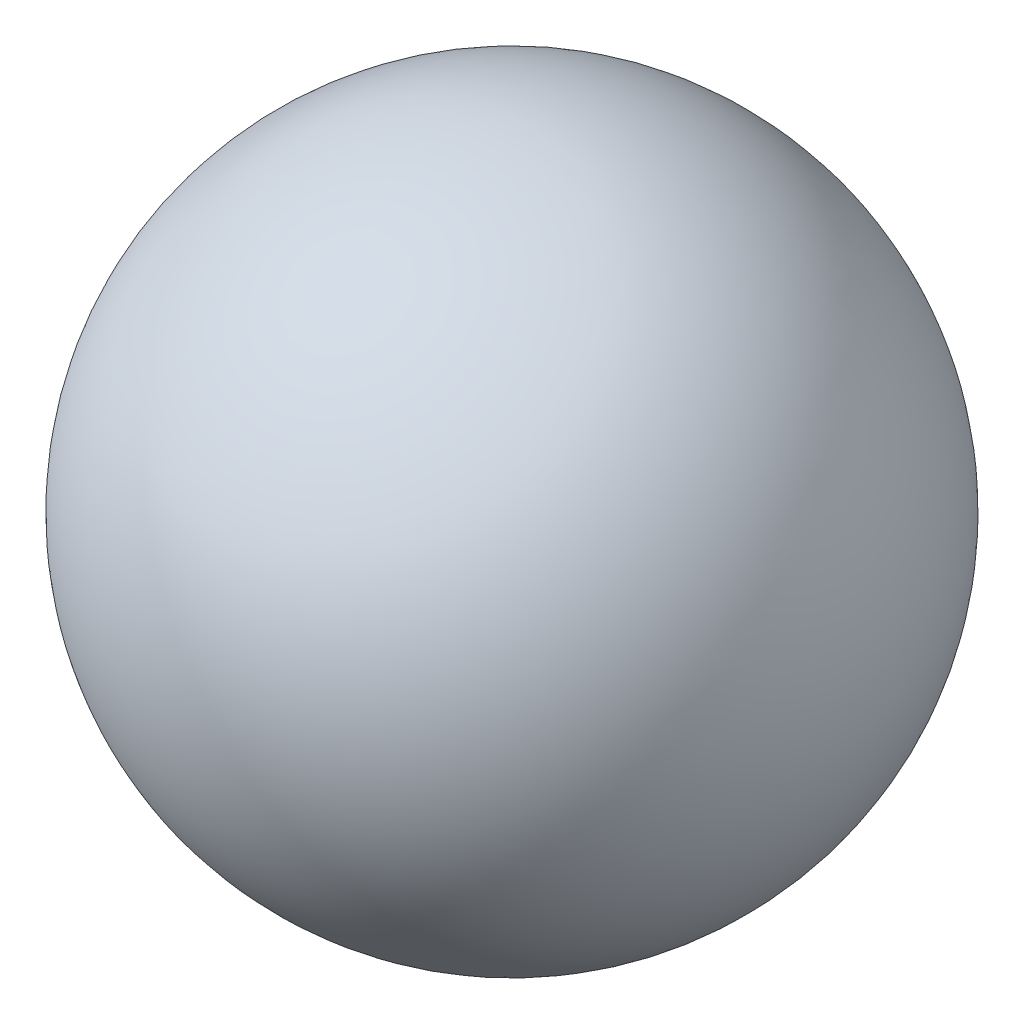
ISO-10303-21;
HEADER;
FILE_DESCRIPTION(('STEP AP214'),'2;1');
FILE_NAME('part.step','',(''),(''),'','','');
FILE_SCHEMA(('AUTOMOTIVE_DESIGN { 1 0 10303 214 1 1 1 1 }'));
ENDSEC;
DATA;
#1=APPLICATION_CONTEXT('core data for automotive mechanical design processes');
#2=APPLICATION_PROTOCOL_DEFINITION('international standard','automotive_design',2000,#1);
#3=PRODUCT_CONTEXT('',#1,'mechanical');
#4=PRODUCT('Part','Part','',(#3));
#5=PRODUCT_RELATED_PRODUCT_CATEGORY('part','',(#4));
#6=PRODUCT_DEFINITION_FORMATION('','',#4);
#7=PRODUCT_DEFINITION_CONTEXT('part definition',#1,'design');
#8=PRODUCT_DEFINITION('design','',#6,#7);
#9=PRODUCT_DEFINITION_SHAPE('','',#8);
#10=(LENGTH_UNIT() NAMED_UNIT(*) SI_UNIT(.MILLI.,.METRE.));
#11=(NAMED_UNIT(*) PLANE_ANGLE_UNIT() SI_UNIT($,.RADIAN.));
#12=(NAMED_UNIT(*) SI_UNIT($,.STERADIAN.) SOLID_ANGLE_UNIT());
#13=UNCERTAINTY_MEASURE_WITH_UNIT(LENGTH_MEASURE(1.E-05),#10,'distance_accuracy_value','');
#14=(GEOMETRIC_REPRESENTATION_CONTEXT(3) GLOBAL_UNCERTAINTY_ASSIGNED_CONTEXT((#13)) GLOBAL_UNIT_ASSIGNED_CONTEXT((#10,
#11,#12)) REPRESENTATION_CONTEXT('',''));
#15=CARTESIAN_POINT('',(0.,0.,0.));
#16=DIRECTION('',(0.,0.,1.));
#17=DIRECTION('',(1.,0.,0.));
#18=AXIS2_PLACEMENT_3D('',#15,#16,#17);
#19=CARTESIAN_POINT('',(0.,0.,0.));
#20=DIRECTION('',(0.,0.,-1.));
#21=DIRECTION('',(1.,0.,0.));
#22=AXIS2_PLACEMENT_3D('',#19,#20,#21);
#23=SPHERICAL_SURFACE('',#22,119.25427);
#24=CARTESIAN_POINT('',(0.,0.,-119.25427));
#25=VERTEX_POINT('',#24);
#26=VERTEX_LOOP('',#25);
#27=FACE_BOUND('',#26,.T.);
#28=ADVANCED_FACE('F33',(#27),#23,.T.);
#29=CLOSED_SHELL('',(#28));
#30=MANIFOLD_SOLID_BREP('B2',#29);
#31=ADVANCED_BREP_SHAPE_REPRESENTATION('',(#18,#30),#14);
#32=SHAPE_DEFINITION_REPRESENTATION(#9,#31);
ENDSEC;
END-ISO-10303-21;
